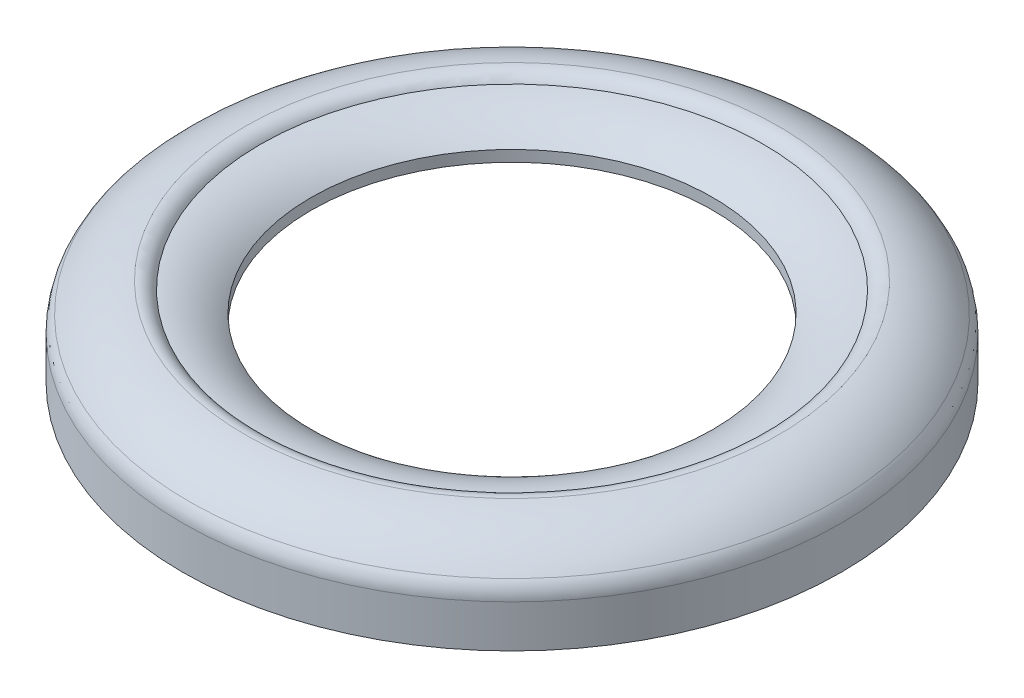
ISO-10303-21;
HEADER;
FILE_DESCRIPTION(('STEP AP214'),'2;1');
FILE_NAME('part.step','',(''),(''),'','','');
FILE_SCHEMA(('AUTOMOTIVE_DESIGN { 1 0 10303 214 1 1 1 1 }'));
ENDSEC;
DATA;
#1=APPLICATION_CONTEXT('core data for automotive mechanical design processes');
#2=APPLICATION_PROTOCOL_DEFINITION('international standard','automotive_design',2000,#1);
#3=PRODUCT_CONTEXT('',#1,'mechanical');
#4=PRODUCT('Part','Part','',(#3));
#5=PRODUCT_RELATED_PRODUCT_CATEGORY('part','',(#4));
#6=PRODUCT_DEFINITION_FORMATION('','',#4);
#7=PRODUCT_DEFINITION_CONTEXT('part definition',#1,'design');
#8=PRODUCT_DEFINITION('design','',#6,#7);
#9=PRODUCT_DEFINITION_SHAPE('','',#8);
#10=(LENGTH_UNIT() NAMED_UNIT(*) SI_UNIT(.MILLI.,.METRE.));
#11=(NAMED_UNIT(*) PLANE_ANGLE_UNIT() SI_UNIT($,.RADIAN.));
#12=(NAMED_UNIT(*) SI_UNIT($,.STERADIAN.) SOLID_ANGLE_UNIT());
#13=UNCERTAINTY_MEASURE_WITH_UNIT(LENGTH_MEASURE(1.E-05),#10,'distance_accuracy_value','');
#14=(GEOMETRIC_REPRESENTATION_CONTEXT(3) GLOBAL_UNCERTAINTY_ASSIGNED_CONTEXT((#13)) GLOBAL_UNIT_ASSIGNED_CONTEXT((#10,
#11,#12)) REPRESENTATION_CONTEXT('',''));
#15=CARTESIAN_POINT('',(0.,0.,0.));
#16=DIRECTION('',(0.,0.,1.));
#17=DIRECTION('',(1.,0.,0.));
#18=AXIS2_PLACEMENT_3D('',#15,#16,#17);
#19=CARTESIAN_POINT('',(-12.5,0.,0.));
#20=DIRECTION('',(0.,-1.,0.));
#21=DIRECTION('',(1.,0.,0.));
#22=AXIS2_PLACEMENT_3D('',#19,#20,#21);
#23=PLANE('',#22);
#24=CARTESIAN_POINT('',(0.,0.,0.));
#25=DIRECTION('',(0.,-1.,0.));
#26=DIRECTION('',(1.,0.,0.));
#27=AXIS2_PLACEMENT_3D('',#24,#25,#26);
#28=CIRCLE('',#27,20.5);
#29=CARTESIAN_POINT('',(20.5,0.,0.));
#30=VERTEX_POINT('',#29);
#31=EDGE_CURVE('E52',#30,#30,#28,.F.);
#32=ORIENTED_EDGE('',*,*,#31,.F.);
#33=EDGE_LOOP('',(#32));
#34=FACE_BOUND('',#33,.T.);
#35=CARTESIAN_POINT('',(0.,0.,0.));
#36=DIRECTION('',(0.,1.,0.));
#37=DIRECTION('',(-1.,0.,0.));
#38=AXIS2_PLACEMENT_3D('',#35,#36,#37);
#39=CIRCLE('',#38,20.);
#40=CARTESIAN_POINT('',(-20.,0.,0.));
#41=VERTEX_POINT('',#40);
#42=EDGE_CURVE('E110',#41,#41,#39,.T.);
#43=ORIENTED_EDGE('',*,*,#42,.T.);
#44=EDGE_LOOP('',(#43));
#45=FACE_BOUND('',#44,.T.);
#46=ADVANCED_FACE('F33',(#34,#45),#23,.T.);
#47=CARTESIAN_POINT('',(0.,5.,0.));
#48=DIRECTION('',(0.,1.,0.));
#49=DIRECTION('',(-1.,0.,0.));
#50=AXIS2_PLACEMENT_3D('',#47,#48,#49);
#51=CYLINDRICAL_SURFACE('',#50,20.5);
#52=CARTESIAN_POINT('',(0.,2.64575131106512,0.));
#53=DIRECTION('',(0.,1.,0.));
#54=DIRECTION('',(-1.,0.,0.));
#55=AXIS2_PLACEMENT_3D('',#52,#53,#54);
#56=CIRCLE('',#55,20.5);
#57=CARTESIAN_POINT('',(-20.5,2.64575131106513,0.));
#58=VERTEX_POINT('',#57);
#59=EDGE_CURVE('E41',#58,#58,#56,.F.);
#60=ORIENTED_EDGE('',*,*,#59,.T.);
#61=EDGE_LOOP('',(#60));
#62=FACE_BOUND('',#61,.T.);
#63=ORIENTED_EDGE('',*,*,#31,.T.);
#64=EDGE_LOOP('',(#63));
#65=FACE_BOUND('',#64,.T.);
#66=ADVANCED_FACE('F77',(#62,#65),#51,.T.);
#67=CARTESIAN_POINT('',(0.,0.,0.));
#68=DIRECTION('',(0.,1.,0.));
#69=DIRECTION('',(-1.,0.,0.));
#70=AXIS2_PLACEMENT_3D('',#67,#68,#69);
#71=TOROIDAL_SURFACE('',#70,16.,5.49999999999999);
#72=CARTESIAN_POINT('',(0.,5.46604938271605,0.));
#73=DIRECTION('',(0.,1.,0.));
#74=DIRECTION('',(-1.,0.,0.));
#75=AXIS2_PLACEMENT_3D('',#72,#73,#74);
#76=CIRCLE('',#75,16.6101673096041);
#77=CARTESIAN_POINT('',(-16.6101673096041,5.46604938271605,0.));
#78=VERTEX_POINT('',#77);
#79=EDGE_CURVE('E10',#78,#78,#76,.F.);
#80=ORIENTED_EDGE('',*,*,#79,.T.);
#81=EDGE_LOOP('',(#80));
#82=FACE_BOUND('',#81,.T.);
#83=CARTESIAN_POINT('',(0.,3.63790805271434,0.));
#84=DIRECTION('',(0.,1.,0.));
#85=DIRECTION('',(-1.,0.,0.));
#86=AXIS2_PLACEMENT_3D('',#83,#84,#85);
#87=CIRCLE('',#86,20.1249999999995);
#88=CARTESIAN_POINT('',(-20.1249999999995,3.63790805271434,0.));
#89=VERTEX_POINT('',#88);
#90=EDGE_CURVE('E46',#89,#89,#87,.T.);
#91=ORIENTED_EDGE('',*,*,#90,.T.);
#92=EDGE_LOOP('',(#91));
#93=FACE_BOUND('',#92,.T.);
#94=ADVANCED_FACE('F59',(#82,#93),#71,.T.);
#95=CARTESIAN_POINT('',(0.,-0.333333333333334,0.));
#96=DIRECTION('',(0.,1.,0.));
#97=DIRECTION('',(-1.,0.,0.));
#98=AXIS2_PLACEMENT_3D('',#95,#96,#97);
#99=TOROIDAL_SURFACE('',#98,16.,5.33333333333333);
#100=CARTESIAN_POINT('',(0.,4.98800524905808,0.));
#101=DIRECTION('',(0.,1.,0.));
#102=DIRECTION('',(-1.,0.,0.));
#103=AXIS2_PLACEMENT_3D('',#100,#101,#102);
#104=CIRCLE('',#103,15.6425085511555);
#105=CARTESIAN_POINT('',(-15.6425085511555,4.98800524905808,0.));
#106=VERTEX_POINT('',#105);
#107=EDGE_CURVE('E50',#106,#106,#104,.T.);
#108=ORIENTED_EDGE('',*,*,#107,.T.);
#109=EDGE_LOOP('',(#108));
#110=FACE_BOUND('',#109,.T.);
#111=CARTESIAN_POINT('',(0.,3.69089882254987,0.));
#112=DIRECTION('',(0.,-1.,0.));
#113=DIRECTION('',(1.,0.,0.));
#114=AXIS2_PLACEMENT_3D('',#111,#112,#113);
#115=CIRCLE('',#114,12.5);
#116=CARTESIAN_POINT('',(12.5,3.69089882254987,0.));
#117=VERTEX_POINT('',#116);
#118=EDGE_CURVE('E37',#117,#117,#115,.F.);
#119=ORIENTED_EDGE('',*,*,#118,.F.);
#120=EDGE_LOOP('',(#119));
#121=FACE_BOUND('',#120,.T.);
#122=ADVANCED_FACE('F71',(#110,#121),#99,.T.);
#123=CARTESIAN_POINT('',(0.,5.,0.));
#124=DIRECTION('',(0.,1.,0.));
#125=DIRECTION('',(-1.,0.,0.));
#126=AXIS2_PLACEMENT_3D('',#123,#124,#125);
#127=CYLINDRICAL_SURFACE('',#126,12.5);
#128=CARTESIAN_POINT('',(0.,2.99999999999999,0.));
#129=DIRECTION('',(0.,1.,0.));
#130=DIRECTION('',(-1.,0.,0.));
#131=AXIS2_PLACEMENT_3D('',#128,#129,#130);
#132=CIRCLE('',#131,12.5);
#133=CARTESIAN_POINT('',(-12.5,3.,0.));
#134=VERTEX_POINT('',#133);
#135=EDGE_CURVE('E116',#134,#134,#132,.T.);
#136=ORIENTED_EDGE('',*,*,#135,.F.);
#137=EDGE_LOOP('',(#136));
#138=FACE_BOUND('',#137,.T.);
#139=ORIENTED_EDGE('',*,*,#118,.T.);
#140=EDGE_LOOP('',(#139));
#141=FACE_BOUND('',#140,.T.);
#142=ADVANCED_FACE('F63',(#138,#141),#127,.F.);
#143=CARTESIAN_POINT('',(0.,2.64575131106512,0.));
#144=DIRECTION('',(0.,-1.,0.));
#145=DIRECTION('',(1.,0.,0.));
#146=AXIS2_PLACEMENT_3D('',#143,#144,#145);
#147=TOROIDAL_SURFACE('',#146,18.9999999999998,1.5);
#148=ORIENTED_EDGE('',*,*,#59,.F.);
#149=EDGE_LOOP('',(#148));
#150=FACE_BOUND('',#149,.T.);
#151=ORIENTED_EDGE('',*,*,#90,.F.);
#152=EDGE_LOOP('',(#151));
#153=FACE_BOUND('',#152,.T.);
#154=ADVANCED_FACE('F61',(#150,#153),#147,.T.);
#155=CARTESIAN_POINT('',(0.,4.47222222222222,0.));
#156=DIRECTION('',(0.,-1.,0.));
#157=DIRECTION('',(1.,0.,0.));
#158=AXIS2_PLACEMENT_3D('',#155,#156,#157);
#159=TOROIDAL_SURFACE('',#158,16.499227798767,1.);
#160=ORIENTED_EDGE('',*,*,#79,.F.);
#161=EDGE_LOOP('',(#160));
#162=FACE_BOUND('',#161,.T.);
#163=ORIENTED_EDGE('',*,*,#107,.F.);
#164=EDGE_LOOP('',(#163));
#165=FACE_BOUND('',#164,.T.);
#166=ADVANCED_FACE('F35',(#162,#165),#159,.T.);
#167=CARTESIAN_POINT('',(0.,5.,0.));
#168=DIRECTION('',(0.,1.,0.));
#169=DIRECTION('',(-1.,0.,0.));
#170=AXIS2_PLACEMENT_3D('',#167,#168,#169);
#171=CYLINDRICAL_SURFACE('',#170,20.);
#172=CARTESIAN_POINT('',(0.,2.64575131106512,0.));
#173=DIRECTION('',(0.,-1.,0.));
#174=DIRECTION('',(1.,0.,0.));
#175=AXIS2_PLACEMENT_3D('',#172,#173,#174);
#176=CIRCLE('',#175,20.);
#177=CARTESIAN_POINT('',(20.,2.64575131106512,0.));
#178=VERTEX_POINT('',#177);
#179=EDGE_CURVE('E100',#178,#178,#176,.T.);
#180=ORIENTED_EDGE('',*,*,#179,.F.);
#181=EDGE_LOOP('',(#180));
#182=FACE_BOUND('',#181,.T.);
#183=ORIENTED_EDGE('',*,*,#42,.F.);
#184=EDGE_LOOP('',(#183));
#185=FACE_BOUND('',#184,.T.);
#186=ADVANCED_FACE('F69',(#182,#185),#171,.F.);
#187=CARTESIAN_POINT('',(0.,0.,0.));
#188=DIRECTION('',(0.,1.,0.));
#189=DIRECTION('',(-1.,0.,0.));
#190=AXIS2_PLACEMENT_3D('',#187,#188,#189);
#191=TOROIDAL_SURFACE('',#190,16.,4.99999999999999);
#192=CARTESIAN_POINT('',(0.,4.96913580246888,0.));
#193=DIRECTION('',(0.,-1.,0.));
#194=DIRECTION('',(1.,0.,0.));
#195=AXIS2_PLACEMENT_3D('',#192,#193,#194);
#196=CIRCLE('',#195,16.5546975541855);
#197=CARTESIAN_POINT('',(16.5546975541855,4.96913580246887,0.));
#198=VERTEX_POINT('',#197);
#199=EDGE_CURVE('E98',#198,#198,#196,.T.);
#200=ORIENTED_EDGE('',*,*,#199,.F.);
#201=EDGE_LOOP('',(#200));
#202=FACE_BOUND('',#201,.T.);
#203=CARTESIAN_POINT('',(0.,3.30718913883121,0.));
#204=DIRECTION('',(0.,-1.,0.));
#205=DIRECTION('',(1.,0.,0.));
#206=AXIS2_PLACEMENT_3D('',#203,#204,#205);
#207=CIRCLE('',#206,19.7499999999996);
#208=CARTESIAN_POINT('',(19.7499999999996,3.3071891388312,0.));
#209=VERTEX_POINT('',#208);
#210=EDGE_CURVE('E105',#209,#209,#207,.F.);
#211=ORIENTED_EDGE('',*,*,#210,.F.);
#212=EDGE_LOOP('',(#211));
#213=FACE_BOUND('',#212,.T.);
#214=ADVANCED_FACE('F123',(#202,#213),#191,.F.);
#215=CARTESIAN_POINT('',(0.,-0.333333333333334,0.));
#216=DIRECTION('',(0.,1.,0.));
#217=DIRECTION('',(-1.,0.,0.));
#218=AXIS2_PLACEMENT_3D('',#215,#216,#217);
#219=TOROIDAL_SURFACE('',#218,16.,4.83333333333333);
#220=CARTESIAN_POINT('',(0.,4.5,0.));
#221=DIRECTION('',(0.,1.,0.));
#222=DIRECTION('',(-1.,0.,0.));
#223=AXIS2_PLACEMENT_3D('',#220,#221,#222);
#224=CIRCLE('',#223,16.);
#225=CARTESIAN_POINT('',(-16.,4.5,0.));
#226=VERTEX_POINT('',#225);
#227=EDGE_CURVE('E113',#226,#226,#224,.T.);
#228=ORIENTED_EDGE('',*,*,#227,.F.);
#229=EDGE_LOOP('',(#228));
#230=FACE_BOUND('',#229,.T.);
#231=ORIENTED_EDGE('',*,*,#135,.T.);
#232=EDGE_LOOP('',(#231));
#233=FACE_BOUND('',#232,.T.);
#234=ADVANCED_FACE('F120',(#230,#233),#219,.F.);
#235=CARTESIAN_POINT('',(0.,2.64575131106512,0.));
#236=DIRECTION('',(0.,-1.,0.));
#237=DIRECTION('',(1.,0.,0.));
#238=AXIS2_PLACEMENT_3D('',#235,#236,#237);
#239=TOROIDAL_SURFACE('',#238,18.9999999999998,1.);
#240=ORIENTED_EDGE('',*,*,#179,.T.);
#241=EDGE_LOOP('',(#240));
#242=FACE_BOUND('',#241,.T.);
#243=ORIENTED_EDGE('',*,*,#210,.T.);
#244=EDGE_LOOP('',(#243));
#245=FACE_BOUND('',#244,.T.);
#246=ADVANCED_FACE('F122',(#242,#245),#239,.F.);
#247=CARTESIAN_POINT('',(0.,4.47222222222222,0.));
#248=DIRECTION('',(0.,-1.,0.));
#249=DIRECTION('',(1.,0.,0.));
#250=AXIS2_PLACEMENT_3D('',#247,#248,#249);
#251=TOROIDAL_SURFACE('',#250,16.499227798767,0.5);
#252=ORIENTED_EDGE('',*,*,#199,.T.);
#253=EDGE_LOOP('',(#252));
#254=FACE_BOUND('',#253,.T.);
#255=ORIENTED_EDGE('',*,*,#227,.T.);
#256=EDGE_LOOP('',(#255));
#257=FACE_BOUND('',#256,.T.);
#258=ADVANCED_FACE('F130',(#254,#257),#251,.F.);
#259=CLOSED_SHELL('',(#46,#66,#94,#122,#142,#154,#166,#186,#214,#234,#246,#258));
#260=MANIFOLD_SOLID_BREP('B2',#259);
#261=ADVANCED_BREP_SHAPE_REPRESENTATION('',(#18,#260),#14);
#262=SHAPE_DEFINITION_REPRESENTATION(#9,#261);
ENDSEC;
END-ISO-10303-21;
